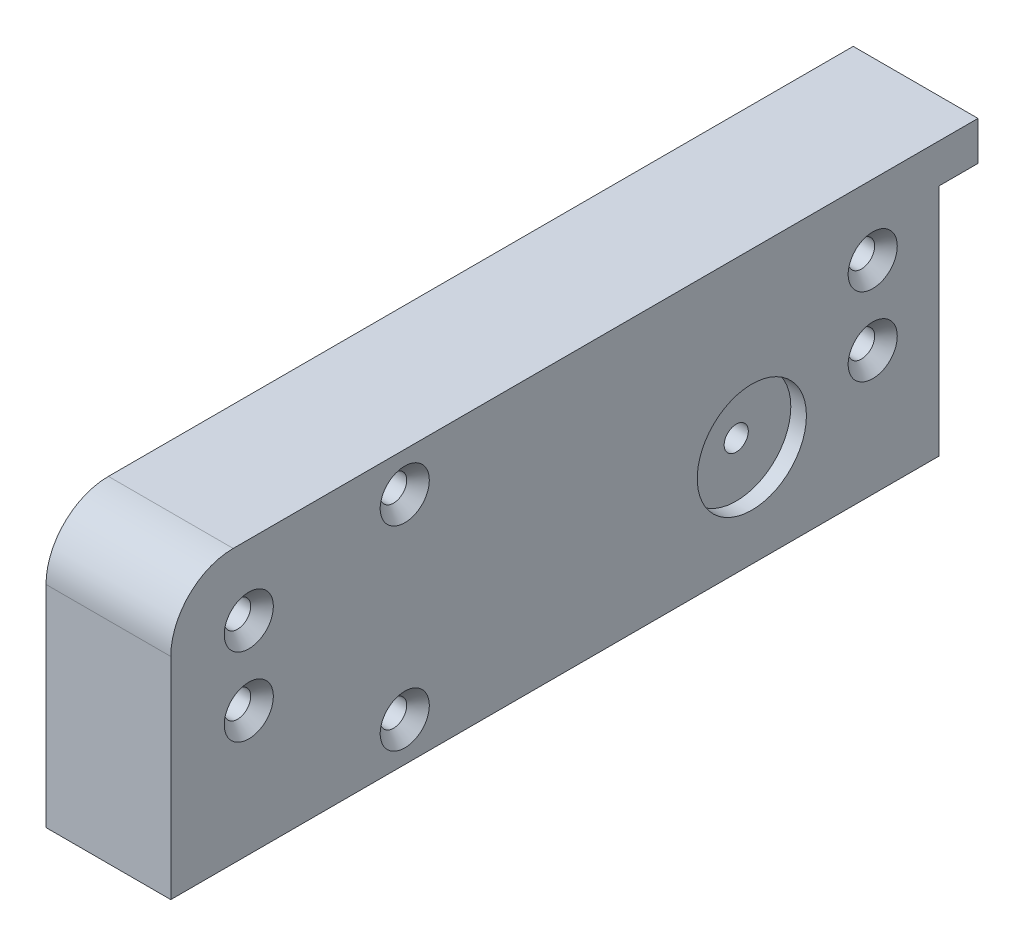
ISO-10303-21;
HEADER;
FILE_DESCRIPTION(('STEP AP214'),'2;1');
FILE_NAME('part.step','',(''),(''),'','','');
FILE_SCHEMA(('AUTOMOTIVE_DESIGN { 1 0 10303 214 1 1 1 1 }'));
ENDSEC;
DATA;
#1=APPLICATION_CONTEXT('core data for automotive mechanical design processes');
#2=APPLICATION_PROTOCOL_DEFINITION('international standard','automotive_design',2000,#1);
#3=PRODUCT_CONTEXT('',#1,'mechanical');
#4=PRODUCT('Part','Part','',(#3));
#5=PRODUCT_RELATED_PRODUCT_CATEGORY('part','',(#4));
#6=PRODUCT_DEFINITION_FORMATION('','',#4);
#7=PRODUCT_DEFINITION_CONTEXT('part definition',#1,'design');
#8=PRODUCT_DEFINITION('design','',#6,#7);
#9=PRODUCT_DEFINITION_SHAPE('','',#8);
#10=(LENGTH_UNIT() NAMED_UNIT(*) SI_UNIT(.MILLI.,.METRE.));
#11=(NAMED_UNIT(*) PLANE_ANGLE_UNIT() SI_UNIT($,.RADIAN.));
#12=(NAMED_UNIT(*) SI_UNIT($,.STERADIAN.) SOLID_ANGLE_UNIT());
#13=UNCERTAINTY_MEASURE_WITH_UNIT(LENGTH_MEASURE(1.E-05),#10,'distance_accuracy_value','');
#14=(GEOMETRIC_REPRESENTATION_CONTEXT(3) GLOBAL_UNCERTAINTY_ASSIGNED_CONTEXT((#13)) GLOBAL_UNIT_ASSIGNED_CONTEXT((#10,
#11,#12)) REPRESENTATION_CONTEXT('',''));
#15=CARTESIAN_POINT('',(0.,0.,0.));
#16=DIRECTION('',(0.,0.,1.));
#17=DIRECTION('',(1.,0.,0.));
#18=AXIS2_PLACEMENT_3D('',#15,#16,#17);
#19=CARTESIAN_POINT('',(0.,13.,24.));
#20=DIRECTION('',(1.,0.,0.));
#21=DIRECTION('',(0.,0.,-1.));
#22=AXIS2_PLACEMENT_3D('',#19,#20,#21);
#23=CYLINDRICAL_SURFACE('',#22,1.55);
#24=CARTESIAN_POINT('',(0.,13.,24.));
#25=DIRECTION('',(1.,0.,0.));
#26=DIRECTION('',(0.,0.,-1.));
#27=AXIS2_PLACEMENT_3D('',#24,#25,#26);
#28=CIRCLE('',#27,1.55);
#29=CARTESIAN_POINT('',(0.,13.,22.45));
#30=VERTEX_POINT('',#29);
#31=EDGE_CURVE('E340',#30,#30,#28,.T.);
#32=ORIENTED_EDGE('',*,*,#31,.F.);
#33=EDGE_LOOP('',(#32));
#34=FACE_BOUND('',#33,.T.);
#35=CARTESIAN_POINT('',(14.,13.,24.));
#36=DIRECTION('',(1.,0.,0.));
#37=DIRECTION('',(0.,0.,-1.));
#38=AXIS2_PLACEMENT_3D('',#35,#36,#37);
#39=CIRCLE('',#38,1.55);
#40=CARTESIAN_POINT('',(14.,13.,22.45));
#41=VERTEX_POINT('',#40);
#42=EDGE_CURVE('E337',#41,#41,#39,.F.);
#43=ORIENTED_EDGE('',*,*,#42,.F.);
#44=EDGE_LOOP('',(#43));
#45=FACE_BOUND('',#44,.T.);
#46=ADVANCED_FACE('F36',(#34,#45),#23,.F.);
#47=CARTESIAN_POINT('',(9.,28.7496306570153,90.0875000000005));
#48=DIRECTION('',(0.,1.,1.94507577148897E-13));
#49=DIRECTION('',(0.,-1.94507577148897E-13,1.));
#50=AXIS2_PLACEMENT_3D('',#47,#48,#49);
#51=PLANE('',#50);
#52=DIRECTION('',(0.,-1.94507577148897E-13,1.));
#53=VECTOR('',#52,1.);
#54=CARTESIAN_POINT('',(6.,28.7496306570153,90.0875000000005));
#55=LINE('',#54,#53);
#56=CARTESIAN_POINT('',(6.,28.7496306570159,86.9125000000005));
#57=VERTEX_POINT('',#56);
#58=CARTESIAN_POINT('',(6.,28.7496306570153,90.0875000000005));
#59=VERTEX_POINT('',#58);
#60=EDGE_CURVE('E207',#57,#59,#55,.T.);
#61=ORIENTED_EDGE('',*,*,#60,.F.);
#62=DIRECTION('',(-1.,0.,0.));
#63=VECTOR('',#62,1.);
#64=CARTESIAN_POINT('',(9.,28.7496306570159,86.9125000000005));
#65=LINE('',#64,#63);
#66=CARTESIAN_POINT('',(9.,28.7496306570159,86.9125000000005));
#67=VERTEX_POINT('',#66);
#68=EDGE_CURVE('E222',#67,#57,#65,.T.);
#69=ORIENTED_EDGE('',*,*,#68,.F.);
#70=DIRECTION('',(0.,1.94507577148897E-13,-1.));
#71=VECTOR('',#70,1.);
#72=CARTESIAN_POINT('',(9.,28.7496306570153,90.0875000000005));
#73=LINE('',#72,#71);
#74=CARTESIAN_POINT('',(9.,28.7496306570153,90.0875000000005));
#75=VERTEX_POINT('',#74);
#76=EDGE_CURVE('E203',#75,#67,#73,.T.);
#77=ORIENTED_EDGE('',*,*,#76,.F.);
#78=DIRECTION('',(-1.,0.,0.));
#79=VECTOR('',#78,1.);
#80=CARTESIAN_POINT('',(9.,28.7496306570153,90.0875000000005));
#81=LINE('',#80,#79);
#82=EDGE_CURVE('E223',#75,#59,#81,.T.);
#83=ORIENTED_EDGE('',*,*,#82,.T.);
#84=EDGE_LOOP('',(#61,#69,#77,#83));
#85=FACE_BOUND('',#84,.T.);
#86=ADVANCED_FACE('F374',(#85),#51,.F.);
#87=CARTESIAN_POINT('',(9.,25.9999999999994,91.675));
#88=DIRECTION('',(0.,0.499999999999836,0.866025403784533));
#89=DIRECTION('',(0.,-0.866025403784534,0.499999999999836));
#90=AXIS2_PLACEMENT_3D('',#87,#88,#89);
#91=PLANE('',#90);
#92=DIRECTION('',(0.,-0.866025403784534,0.499999999999836));
#93=VECTOR('',#92,1.);
#94=CARTESIAN_POINT('',(6.,25.9999999999994,91.675));
#95=LINE('',#94,#93);
#96=CARTESIAN_POINT('',(6.,25.9999999999994,91.675));
#97=VERTEX_POINT('',#96);
#98=EDGE_CURVE('E802',#59,#97,#95,.T.);
#99=ORIENTED_EDGE('',*,*,#98,.F.);
#100=ORIENTED_EDGE('',*,*,#82,.F.);
#101=DIRECTION('',(0.,0.866025403784533,-0.499999999999836));
#102=VECTOR('',#101,1.);
#103=CARTESIAN_POINT('',(9.,25.9999999999994,91.675));
#104=LINE('',#103,#102);
#105=CARTESIAN_POINT('',(9.,25.9999999999994,91.675));
#106=VERTEX_POINT('',#105);
#107=EDGE_CURVE('E219',#106,#75,#104,.T.);
#108=ORIENTED_EDGE('',*,*,#107,.F.);
#109=DIRECTION('',(-1.,0.,0.));
#110=VECTOR('',#109,1.);
#111=CARTESIAN_POINT('',(9.,25.9999999999994,91.675));
#112=LINE('',#111,#110);
#113=EDGE_CURVE('E227',#106,#97,#112,.T.);
#114=ORIENTED_EDGE('',*,*,#113,.T.);
#115=EDGE_LOOP('',(#99,#100,#108,#114));
#116=FACE_BOUND('',#115,.T.);
#117=ADVANCED_FACE('F380',(#116),#91,.F.);
#118=CARTESIAN_POINT('',(9.,23.2503693429841,90.0874999999995));
#119=DIRECTION('',(0.,-0.500000000000167,0.866025403784342));
#120=DIRECTION('',(0.,-0.866025403784342,-0.500000000000168));
#121=AXIS2_PLACEMENT_3D('',#118,#119,#120);
#122=PLANE('',#121);
#123=DIRECTION('',(0.,-0.866025403784342,-0.500000000000168));
#124=VECTOR('',#123,1.);
#125=CARTESIAN_POINT('',(6.,23.2503693429841,90.0874999999995));
#126=LINE('',#125,#124);
#127=CARTESIAN_POINT('',(6.,23.2503693429841,90.0874999999995));
#128=VERTEX_POINT('',#127);
#129=EDGE_CURVE('E800',#97,#128,#126,.T.);
#130=ORIENTED_EDGE('',*,*,#129,.F.);
#131=ORIENTED_EDGE('',*,*,#113,.F.);
#132=DIRECTION('',(0.,0.866025403784342,0.500000000000167));
#133=VECTOR('',#132,1.);
#134=CARTESIAN_POINT('',(9.,23.2503693429841,90.0874999999995));
#135=LINE('',#134,#133);
#136=CARTESIAN_POINT('',(9.,23.2503693429841,90.0874999999995));
#137=VERTEX_POINT('',#136);
#138=EDGE_CURVE('E216',#137,#106,#135,.T.);
#139=ORIENTED_EDGE('',*,*,#138,.F.);
#140=DIRECTION('',(-1.,0.,0.));
#141=VECTOR('',#140,1.);
#142=CARTESIAN_POINT('',(9.,23.2503693429841,90.0874999999995));
#143=LINE('',#142,#141);
#144=EDGE_CURVE('E230',#137,#128,#143,.T.);
#145=ORIENTED_EDGE('',*,*,#144,.T.);
#146=EDGE_LOOP('',(#130,#131,#139,#145));
#147=FACE_BOUND('',#146,.T.);
#148=ADVANCED_FACE('F435',(#147),#122,.F.);
#149=CARTESIAN_POINT('',(9.,23.2503693429847,86.9124999999995));
#150=DIRECTION('',(0.,-1.,-1.93414837951431E-13));
#151=DIRECTION('',(0.,1.93414837951431E-13,-1.));
#152=AXIS2_PLACEMENT_3D('',#149,#150,#151);
#153=PLANE('',#152);
#154=DIRECTION('',(0.,1.93414837951431E-13,-1.));
#155=VECTOR('',#154,1.);
#156=CARTESIAN_POINT('',(6.,23.2503693429847,86.9124999999995));
#157=LINE('',#156,#155);
#158=CARTESIAN_POINT('',(6.,23.2503693429847,86.9124999999995));
#159=VERTEX_POINT('',#158);
#160=EDGE_CURVE('E798',#128,#159,#157,.T.);
#161=ORIENTED_EDGE('',*,*,#160,.F.);
#162=ORIENTED_EDGE('',*,*,#144,.F.);
#163=DIRECTION('',(0.,-1.93414837951431E-13,1.));
#164=VECTOR('',#163,1.);
#165=CARTESIAN_POINT('',(9.,23.2503693429847,86.9124999999995));
#166=LINE('',#165,#164);
#167=CARTESIAN_POINT('',(9.,23.2503693429847,86.9124999999995));
#168=VERTEX_POINT('',#167);
#169=EDGE_CURVE('E213',#168,#137,#166,.T.);
#170=ORIENTED_EDGE('',*,*,#169,.F.);
#171=DIRECTION('',(-1.,0.,0.));
#172=VECTOR('',#171,1.);
#173=CARTESIAN_POINT('',(9.,23.2503693429847,86.9124999999995));
#174=LINE('',#173,#172);
#175=EDGE_CURVE('E233',#168,#159,#174,.T.);
#176=ORIENTED_EDGE('',*,*,#175,.T.);
#177=EDGE_LOOP('',(#161,#162,#170,#176));
#178=FACE_BOUND('',#177,.T.);
#179=ADVANCED_FACE('F439',(#178),#153,.F.);
#180=CARTESIAN_POINT('',(9.,26.0000000000006,85.325));
#181=DIRECTION('',(0.,-0.49999999999983,-0.866025403784537));
#182=DIRECTION('',(0.,0.866025403784537,-0.49999999999983));
#183=AXIS2_PLACEMENT_3D('',#180,#181,#182);
#184=PLANE('',#183);
#185=DIRECTION('',(0.,0.866025403784537,-0.49999999999983));
#186=VECTOR('',#185,1.);
#187=CARTESIAN_POINT('',(6.,26.0000000000006,85.325));
#188=LINE('',#187,#186);
#189=CARTESIAN_POINT('',(6.,26.0000000000006,85.325));
#190=VERTEX_POINT('',#189);
#191=EDGE_CURVE('E186',#159,#190,#188,.T.);
#192=ORIENTED_EDGE('',*,*,#191,.F.);
#193=ORIENTED_EDGE('',*,*,#175,.F.);
#194=DIRECTION('',(0.,-0.866025403784537,0.49999999999983));
#195=VECTOR('',#194,1.);
#196=CARTESIAN_POINT('',(9.,26.0000000000006,85.325));
#197=LINE('',#196,#195);
#198=CARTESIAN_POINT('',(9.,26.0000000000006,85.325));
#199=VERTEX_POINT('',#198);
#200=EDGE_CURVE('E210',#199,#168,#197,.T.);
#201=ORIENTED_EDGE('',*,*,#200,.F.);
#202=DIRECTION('',(-1.,0.,0.));
#203=VECTOR('',#202,1.);
#204=CARTESIAN_POINT('',(9.,26.0000000000006,85.325));
#205=LINE('',#204,#203);
#206=EDGE_CURVE('E236',#199,#190,#205,.T.);
#207=ORIENTED_EDGE('',*,*,#206,.T.);
#208=EDGE_LOOP('',(#192,#193,#201,#207));
#209=FACE_BOUND('',#208,.T.);
#210=ADVANCED_FACE('F443',(#209),#184,.F.);
#211=CARTESIAN_POINT('',(9.,28.7496306570159,86.9125000000005));
#212=DIRECTION('',(0.,0.500000000000163,-0.866025403784345));
#213=DIRECTION('',(0.,0.866025403784345,0.500000000000163));
#214=AXIS2_PLACEMENT_3D('',#211,#212,#213);
#215=PLANE('',#214);
#216=DIRECTION('',(0.,0.866025403784345,0.500000000000163));
#217=VECTOR('',#216,1.);
#218=CARTESIAN_POINT('',(6.,28.7496306570159,86.9125000000005));
#219=LINE('',#218,#217);
#220=EDGE_CURVE('E176',#190,#57,#219,.T.);
#221=ORIENTED_EDGE('',*,*,#220,.F.);
#222=ORIENTED_EDGE('',*,*,#206,.F.);
#223=DIRECTION('',(0.,-0.866025403784345,-0.500000000000163));
#224=VECTOR('',#223,1.);
#225=CARTESIAN_POINT('',(9.,28.7496306570159,86.9125000000005));
#226=LINE('',#225,#224);
#227=EDGE_CURVE('E206',#67,#199,#226,.T.);
#228=ORIENTED_EDGE('',*,*,#227,.F.);
#229=ORIENTED_EDGE('',*,*,#68,.T.);
#230=EDGE_LOOP('',(#221,#222,#228,#229));
#231=FACE_BOUND('',#230,.T.);
#232=ADVANCED_FACE('F428',(#231),#215,.F.);
#233=CARTESIAN_POINT('',(9.,26.,11.675));
#234=DIRECTION('',(0.,0.499999999999971,0.866025403784456));
#235=DIRECTION('',(0.,-0.866025403784456,0.499999999999971));
#236=AXIS2_PLACEMENT_3D('',#233,#234,#235);
#237=PLANE('',#236);
#238=DIRECTION('',(0.,-0.866025403784456,0.499999999999971));
#239=VECTOR('',#238,1.);
#240=CARTESIAN_POINT('',(6.,26.,11.675));
#241=LINE('',#240,#239);
#242=CARTESIAN_POINT('',(6.,28.7496306570155,10.0875000000002));
#243=VERTEX_POINT('',#242);
#244=CARTESIAN_POINT('',(6.,26.,11.675));
#245=VERTEX_POINT('',#244);
#246=EDGE_CURVE('E169',#243,#245,#241,.T.);
#247=ORIENTED_EDGE('',*,*,#246,.F.);
#248=DIRECTION('',(-1.,0.,0.));
#249=VECTOR('',#248,1.);
#250=CARTESIAN_POINT('',(9.,28.7496306570155,10.0875000000002));
#251=LINE('',#250,#249);
#252=CARTESIAN_POINT('',(9.,28.7496306570155,10.0875000000002));
#253=VERTEX_POINT('',#252);
#254=EDGE_CURVE('E183',#253,#243,#251,.T.);
#255=ORIENTED_EDGE('',*,*,#254,.F.);
#256=DIRECTION('',(0.,0.866025403784456,-0.499999999999971));
#257=VECTOR('',#256,1.);
#258=CARTESIAN_POINT('',(9.,26.,11.675));
#259=LINE('',#258,#257);
#260=CARTESIAN_POINT('',(9.,26.,11.675));
#261=VERTEX_POINT('',#260);
#262=EDGE_CURVE('E226',#261,#253,#259,.T.);
#263=ORIENTED_EDGE('',*,*,#262,.F.);
#264=DIRECTION('',(-1.,0.,0.));
#265=VECTOR('',#264,1.);
#266=CARTESIAN_POINT('',(9.,26.,11.675));
#267=LINE('',#266,#265);
#268=EDGE_CURVE('E185',#261,#245,#267,.T.);
#269=ORIENTED_EDGE('',*,*,#268,.T.);
#270=EDGE_LOOP('',(#247,#255,#263,#269));
#271=FACE_BOUND('',#270,.T.);
#272=ADVANCED_FACE('F181',(#271),#237,.F.);
#273=CARTESIAN_POINT('',(9.,23.2503693429844,10.0875));
#274=DIRECTION('',(0.,-0.500000000000007,0.866025403784435));
#275=DIRECTION('',(0.,-0.866025403784435,-0.500000000000007));
#276=AXIS2_PLACEMENT_3D('',#273,#274,#275);
#277=PLANE('',#276);
#278=DIRECTION('',(0.,-0.866025403784435,-0.500000000000007));
#279=VECTOR('',#278,1.);
#280=CARTESIAN_POINT('',(6.,23.2503693429844,10.0875));
#281=LINE('',#280,#279);
#282=CARTESIAN_POINT('',(6.,23.2503693429844,10.0875));
#283=VERTEX_POINT('',#282);
#284=EDGE_CURVE('E187',#245,#283,#281,.T.);
#285=ORIENTED_EDGE('',*,*,#284,.F.);
#286=ORIENTED_EDGE('',*,*,#268,.F.);
#287=DIRECTION('',(0.,0.866025403784435,0.500000000000007));
#288=VECTOR('',#287,1.);
#289=CARTESIAN_POINT('',(9.,23.2503693429844,10.0875));
#290=LINE('',#289,#288);
#291=CARTESIAN_POINT('',(9.,23.2503693429844,10.0875));
#292=VERTEX_POINT('',#291);
#293=EDGE_CURVE('E194',#292,#261,#290,.T.);
#294=ORIENTED_EDGE('',*,*,#293,.F.);
#295=DIRECTION('',(-1.,0.,0.));
#296=VECTOR('',#295,1.);
#297=CARTESIAN_POINT('',(9.,23.2503693429844,10.0875));
#298=LINE('',#297,#296);
#299=EDGE_CURVE('E816',#292,#283,#298,.T.);
#300=ORIENTED_EDGE('',*,*,#299,.T.);
#301=EDGE_LOOP('',(#285,#286,#294,#300));
#302=FACE_BOUND('',#301,.T.);
#303=ADVANCED_FACE('F407',(#302),#277,.F.);
#304=CARTESIAN_POINT('',(9.,23.2503693429844,6.91249999999998));
#305=DIRECTION('',(0.,-1.,0.));
#306=DIRECTION('',(0.,0.,-1.));
#307=AXIS2_PLACEMENT_3D('',#304,#305,#306);
#308=PLANE('',#307);
#309=DIRECTION('',(0.,0.,-1.));
#310=VECTOR('',#309,1.);
#311=CARTESIAN_POINT('',(6.,23.2503693429844,6.91249999999998));
#312=LINE('',#311,#310);
#313=CARTESIAN_POINT('',(6.,23.2503693429844,6.91249999999998));
#314=VERTEX_POINT('',#313);
#315=EDGE_CURVE('E794',#283,#314,#312,.T.);
#316=ORIENTED_EDGE('',*,*,#315,.F.);
#317=ORIENTED_EDGE('',*,*,#299,.F.);
#318=DIRECTION('',(0.,0.,1.));
#319=VECTOR('',#318,1.);
#320=CARTESIAN_POINT('',(9.,23.2503693429844,6.91249999999998));
#321=LINE('',#320,#319);
#322=CARTESIAN_POINT('',(9.,23.2503693429844,6.91249999999998));
#323=VERTEX_POINT('',#322);
#324=EDGE_CURVE('E199',#323,#292,#321,.T.);
#325=ORIENTED_EDGE('',*,*,#324,.F.);
#326=DIRECTION('',(-1.,0.,0.));
#327=VECTOR('',#326,1.);
#328=CARTESIAN_POINT('',(9.,23.2503693429844,6.91249999999998));
#329=LINE('',#328,#327);
#330=EDGE_CURVE('E819',#323,#314,#329,.T.);
#331=ORIENTED_EDGE('',*,*,#330,.T.);
#332=EDGE_LOOP('',(#316,#317,#325,#331));
#333=FACE_BOUND('',#332,.T.);
#334=ADVANCED_FACE('F410',(#333),#308,.F.);
#335=CARTESIAN_POINT('',(9.,26.,5.325));
#336=DIRECTION('',(0.,-0.499999999999994,-0.866025403784442));
#337=DIRECTION('',(0.,0.866025403784442,-0.499999999999994));
#338=AXIS2_PLACEMENT_3D('',#335,#336,#337);
#339=PLANE('',#338);
#340=DIRECTION('',(0.,0.866025403784442,-0.499999999999994));
#341=VECTOR('',#340,1.);
#342=CARTESIAN_POINT('',(6.,26.,5.325));
#343=LINE('',#342,#341);
#344=CARTESIAN_POINT('',(6.,26.,5.325));
#345=VERTEX_POINT('',#344);
#346=EDGE_CURVE('E792',#314,#345,#343,.T.);
#347=ORIENTED_EDGE('',*,*,#346,.F.);
#348=ORIENTED_EDGE('',*,*,#330,.F.);
#349=DIRECTION('',(0.,-0.866025403784442,0.499999999999994));
#350=VECTOR('',#349,1.);
#351=CARTESIAN_POINT('',(9.,26.,5.325));
#352=LINE('',#351,#350);
#353=CARTESIAN_POINT('',(9.,26.,5.325));
#354=VERTEX_POINT('',#353);
#355=EDGE_CURVE('E810',#354,#323,#352,.T.);
#356=ORIENTED_EDGE('',*,*,#355,.F.);
#357=DIRECTION('',(-1.,0.,0.));
#358=VECTOR('',#357,1.);
#359=CARTESIAN_POINT('',(9.,26.,5.325));
#360=LINE('',#359,#358);
#361=EDGE_CURVE('E196',#354,#345,#360,.T.);
#362=ORIENTED_EDGE('',*,*,#361,.T.);
#363=EDGE_LOOP('',(#347,#348,#356,#362));
#364=FACE_BOUND('',#363,.T.);
#365=ADVANCED_FACE('F414',(#364),#339,.F.);
#366=CARTESIAN_POINT('',(9.,28.7496306570156,6.91250000000002));
#367=DIRECTION('',(0.,0.500000000000006,-0.866025403784435));
#368=DIRECTION('',(0.,0.866025403784435,0.500000000000006));
#369=AXIS2_PLACEMENT_3D('',#366,#367,#368);
#370=PLANE('',#369);
#371=DIRECTION('',(0.,0.866025403784435,0.500000000000006));
#372=VECTOR('',#371,1.);
#373=CARTESIAN_POINT('',(6.,28.7496306570156,6.91250000000002));
#374=LINE('',#373,#372);
#375=CARTESIAN_POINT('',(6.,28.7496306570156,6.91250000000002));
#376=VERTEX_POINT('',#375);
#377=EDGE_CURVE('E172',#345,#376,#374,.T.);
#378=ORIENTED_EDGE('',*,*,#377,.F.);
#379=ORIENTED_EDGE('',*,*,#361,.F.);
#380=DIRECTION('',(0.,-0.866025403784435,-0.500000000000006));
#381=VECTOR('',#380,1.);
#382=CARTESIAN_POINT('',(9.,28.7496306570156,6.91250000000002));
#383=LINE('',#382,#381);
#384=CARTESIAN_POINT('',(9.,28.7496306570156,6.91250000000002));
#385=VERTEX_POINT('',#384);
#386=EDGE_CURVE('E807',#385,#354,#383,.T.);
#387=ORIENTED_EDGE('',*,*,#386,.F.);
#388=DIRECTION('',(-1.,0.,0.));
#389=VECTOR('',#388,1.);
#390=CARTESIAN_POINT('',(9.,28.7496306570156,6.91250000000002));
#391=LINE('',#390,#389);
#392=EDGE_CURVE('E193',#385,#376,#391,.T.);
#393=ORIENTED_EDGE('',*,*,#392,.T.);
#394=EDGE_LOOP('',(#378,#379,#387,#393));
#395=FACE_BOUND('',#394,.T.);
#396=ADVANCED_FACE('F418',(#395),#370,.F.);
#397=CARTESIAN_POINT('',(9.,28.7496306570155,10.0875000000002));
#398=DIRECTION('',(0.,1.,0.));
#399=DIRECTION('',(0.,0.,1.));
#400=AXIS2_PLACEMENT_3D('',#397,#398,#399);
#401=PLANE('',#400);
#402=DIRECTION('',(0.,0.,1.));
#403=VECTOR('',#402,1.);
#404=CARTESIAN_POINT('',(6.,28.7496306570155,10.0875000000002));
#405=LINE('',#404,#403);
#406=EDGE_CURVE('E166',#376,#243,#405,.T.);
#407=ORIENTED_EDGE('',*,*,#406,.F.);
#408=ORIENTED_EDGE('',*,*,#392,.F.);
#409=DIRECTION('',(0.,0.,-1.));
#410=VECTOR('',#409,1.);
#411=CARTESIAN_POINT('',(9.,28.7496306570155,10.0875000000002));
#412=LINE('',#411,#410);
#413=EDGE_CURVE('E191',#253,#385,#412,.T.);
#414=ORIENTED_EDGE('',*,*,#413,.F.);
#415=ORIENTED_EDGE('',*,*,#254,.T.);
#416=EDGE_LOOP('',(#407,#408,#414,#415));
#417=FACE_BOUND('',#416,.T.);
#418=ADVANCED_FACE('F189',(#417),#401,.F.);
#419=CARTESIAN_POINT('',(16.,26.,8.5));
#420=DIRECTION('',(1.,0.,0.));
#421=DIRECTION('',(0.,0.,-1.));
#422=AXIS2_PLACEMENT_3D('',#419,#420,#421);
#423=CYLINDRICAL_SURFACE('',#422,1.69999999999999);
#424=CARTESIAN_POINT('',(14.55,26.,8.5));
#425=DIRECTION('',(1.,0.,0.));
#426=DIRECTION('',(0.,0.,-1.));
#427=AXIS2_PLACEMENT_3D('',#424,#425,#426);
#428=CIRCLE('',#427,1.69999999999999);
#429=CARTESIAN_POINT('',(14.55,26.,6.80000000000001));
#430=VERTEX_POINT('',#429);
#431=EDGE_CURVE('E278',#430,#430,#428,.T.);
#432=ORIENTED_EDGE('',*,*,#431,.T.);
#433=EDGE_LOOP('',(#432));
#434=FACE_BOUND('',#433,.T.);
#435=CARTESIAN_POINT('',(9.,26.,8.5));
#436=DIRECTION('',(-1.,0.,0.));
#437=DIRECTION('',(0.,0.,1.));
#438=AXIS2_PLACEMENT_3D('',#435,#436,#437);
#439=CIRCLE('',#438,1.69999999999999);
#440=CARTESIAN_POINT('',(9.,26.,10.2));
#441=VERTEX_POINT('',#440);
#442=EDGE_CURVE('E245',#441,#441,#439,.F.);
#443=ORIENTED_EDGE('',*,*,#442,.F.);
#444=EDGE_LOOP('',(#443));
#445=FACE_BOUND('',#444,.T.);
#446=ADVANCED_FACE('F425',(#434,#445),#423,.F.);
#447=CARTESIAN_POINT('',(16.,26.,88.5));
#448=DIRECTION('',(1.,0.,0.));
#449=DIRECTION('',(0.,0.,-1.));
#450=AXIS2_PLACEMENT_3D('',#447,#448,#449);
#451=CYLINDRICAL_SURFACE('',#450,1.69999999999999);
#452=CARTESIAN_POINT('',(14.55,26.,88.5));
#453=DIRECTION('',(1.,0.,0.));
#454=DIRECTION('',(0.,0.,-1.));
#455=AXIS2_PLACEMENT_3D('',#452,#453,#454);
#456=CIRCLE('',#455,1.69999999999999);
#457=CARTESIAN_POINT('',(14.55,26.,86.8));
#458=VERTEX_POINT('',#457);
#459=EDGE_CURVE('E244',#458,#458,#456,.T.);
#460=ORIENTED_EDGE('',*,*,#459,.T.);
#461=EDGE_LOOP('',(#460));
#462=FACE_BOUND('',#461,.T.);
#463=CARTESIAN_POINT('',(9.,26.,88.5));
#464=DIRECTION('',(-1.,0.,0.));
#465=DIRECTION('',(0.,0.,1.));
#466=AXIS2_PLACEMENT_3D('',#463,#464,#465);
#467=CIRCLE('',#466,1.69999999999999);
#468=CARTESIAN_POINT('',(9.,26.,90.2));
#469=VERTEX_POINT('',#468);
#470=EDGE_CURVE('E330',#469,#469,#467,.F.);
#471=ORIENTED_EDGE('',*,*,#470,.F.);
#472=EDGE_LOOP('',(#471));
#473=FACE_BOUND('',#472,.T.);
#474=ADVANCED_FACE('F455',(#462,#473),#451,.F.);
#475=CARTESIAN_POINT('',(16.,30.,0.));
#476=DIRECTION('',(0.,0.,1.));
#477=DIRECTION('',(0.,-1.,0.));
#478=AXIS2_PLACEMENT_3D('',#475,#476,#477);
#479=PLANE('',#478);
#480=DIRECTION('',(0.,1.,0.));
#481=VECTOR('',#480,1.);
#482=CARTESIAN_POINT('',(0.,30.,0.));
#483=LINE('',#482,#481);
#484=CARTESIAN_POINT('',(0.,0.,0.));
#485=VERTEX_POINT('',#484);
#486=CARTESIAN_POINT('',(0.,30.,0.));
#487=VERTEX_POINT('',#486);
#488=EDGE_CURVE('E290',#485,#487,#483,.T.);
#489=ORIENTED_EDGE('',*,*,#488,.T.);
#490=DIRECTION('',(-1.,0.,0.));
#491=VECTOR('',#490,1.);
#492=CARTESIAN_POINT('',(16.,30.,0.));
#493=LINE('',#492,#491);
#494=CARTESIAN_POINT('',(16.,30.,0.));
#495=VERTEX_POINT('',#494);
#496=EDGE_CURVE('E177',#495,#487,#493,.T.);
#497=ORIENTED_EDGE('',*,*,#496,.F.);
#498=DIRECTION('',(0.,1.,0.));
#499=VECTOR('',#498,1.);
#500=CARTESIAN_POINT('',(16.,30.,0.));
#501=LINE('',#500,#499);
#502=CARTESIAN_POINT('',(16.,0.,0.));
#503=VERTEX_POINT('',#502);
#504=EDGE_CURVE('E291',#503,#495,#501,.T.);
#505=ORIENTED_EDGE('',*,*,#504,.F.);
#506=DIRECTION('',(-1.,0.,0.));
#507=VECTOR('',#506,1.);
#508=CARTESIAN_POINT('',(16.,0.,0.));
#509=LINE('',#508,#507);
#510=EDGE_CURVE('E305',#503,#485,#509,.T.);
#511=ORIENTED_EDGE('',*,*,#510,.T.);
#512=EDGE_LOOP('',(#489,#497,#505,#511));
#513=FACE_BOUND('',#512,.T.);
#514=ADVANCED_FACE('F360',(#513),#479,.F.);
#515=CARTESIAN_POINT('',(16.,30.,-4.99999999999999));
#516=DIRECTION('',(0.,1.,0.));
#517=DIRECTION('',(0.,0.,1.));
#518=AXIS2_PLACEMENT_3D('',#515,#516,#517);
#519=PLANE('',#518);
#520=DIRECTION('',(0.,0.,-1.));
#521=VECTOR('',#520,1.);
#522=CARTESIAN_POINT('',(0.,30.,-4.99999999999999));
#523=LINE('',#522,#521);
#524=CARTESIAN_POINT('',(0.,30.,-4.99999999999999));
#525=VERTEX_POINT('',#524);
#526=EDGE_CURVE('E308',#487,#525,#523,.T.);
#527=ORIENTED_EDGE('',*,*,#526,.T.);
#528=DIRECTION('',(-1.,0.,0.));
#529=VECTOR('',#528,1.);
#530=CARTESIAN_POINT('',(16.,30.,-4.99999999999999));
#531=LINE('',#530,#529);
#532=CARTESIAN_POINT('',(16.,30.,-4.99999999999999));
#533=VERTEX_POINT('',#532);
#534=EDGE_CURVE('E325',#533,#525,#531,.T.);
#535=ORIENTED_EDGE('',*,*,#534,.F.);
#536=DIRECTION('',(0.,0.,-1.));
#537=VECTOR('',#536,1.);
#538=CARTESIAN_POINT('',(16.,30.,-4.99999999999999));
#539=LINE('',#538,#537);
#540=EDGE_CURVE('E294',#495,#533,#539,.T.);
#541=ORIENTED_EDGE('',*,*,#540,.F.);
#542=ORIENTED_EDGE('',*,*,#496,.T.);
#543=EDGE_LOOP('',(#527,#535,#541,#542));
#544=FACE_BOUND('',#543,.T.);
#545=ADVANCED_FACE('F513',(#544),#519,.F.);
#546=CARTESIAN_POINT('',(16.,35.,-4.99999999999999));
#547=DIRECTION('',(0.,0.,1.));
#548=DIRECTION('',(1.,0.,0.));
#549=AXIS2_PLACEMENT_3D('',#546,#547,#548);
#550=PLANE('',#549);
#551=DIRECTION('',(0.,1.,0.));
#552=VECTOR('',#551,1.);
#553=CARTESIAN_POINT('',(0.,35.,-4.99999999999999));
#554=LINE('',#553,#552);
#555=CARTESIAN_POINT('',(0.,35.,-4.99999999999999));
#556=VERTEX_POINT('',#555);
#557=EDGE_CURVE('E310',#525,#556,#554,.T.);
#558=ORIENTED_EDGE('',*,*,#557,.T.);
#559=DIRECTION('',(-1.,0.,0.));
#560=VECTOR('',#559,1.);
#561=CARTESIAN_POINT('',(16.,35.,-4.99999999999999));
#562=LINE('',#561,#560);
#563=CARTESIAN_POINT('',(16.,35.,-4.99999999999999));
#564=VERTEX_POINT('',#563);
#565=EDGE_CURVE('E322',#564,#556,#562,.T.);
#566=ORIENTED_EDGE('',*,*,#565,.F.);
#567=DIRECTION('',(0.,1.,0.));
#568=VECTOR('',#567,1.);
#569=CARTESIAN_POINT('',(16.,35.,-4.99999999999999));
#570=LINE('',#569,#568);
#571=EDGE_CURVE('E297',#533,#564,#570,.T.);
#572=ORIENTED_EDGE('',*,*,#571,.F.);
#573=ORIENTED_EDGE('',*,*,#534,.T.);
#574=EDGE_LOOP('',(#558,#566,#572,#573));
#575=FACE_BOUND('',#574,.T.);
#576=ADVANCED_FACE('F510',(#575),#550,.F.);
#577=CARTESIAN_POINT('',(16.,35.,98.5));
#578=DIRECTION('',(0.,-1.,0.));
#579=DIRECTION('',(0.,0.,-1.));
#580=AXIS2_PLACEMENT_3D('',#577,#578,#579);
#581=PLANE('',#580);
#582=DIRECTION('',(0.,0.,1.));
#583=VECTOR('',#582,1.);
#584=CARTESIAN_POINT('',(0.,35.,98.5));
#585=LINE('',#584,#583);
#586=CARTESIAN_POINT('',(0.,35.,90.5));
#587=VERTEX_POINT('',#586);
#588=EDGE_CURVE('E312',#556,#587,#585,.T.);
#589=ORIENTED_EDGE('',*,*,#588,.T.);
#590=DIRECTION('',(-1.,0.,0.));
#591=VECTOR('',#590,1.);
#592=CARTESIAN_POINT('',(16.,35.,90.5));
#593=LINE('',#592,#591);
#594=CARTESIAN_POINT('',(16.,35.,90.5));
#595=VERTEX_POINT('',#594);
#596=EDGE_CURVE('E44',#587,#595,#593,.F.);
#597=ORIENTED_EDGE('',*,*,#596,.T.);
#598=DIRECTION('',(0.,0.,1.));
#599=VECTOR('',#598,1.);
#600=CARTESIAN_POINT('',(16.,35.,98.5));
#601=LINE('',#600,#599);
#602=EDGE_CURVE('E299',#564,#595,#601,.T.);
#603=ORIENTED_EDGE('',*,*,#602,.F.);
#604=ORIENTED_EDGE('',*,*,#565,.T.);
#605=EDGE_LOOP('',(#589,#597,#603,#604));
#606=FACE_BOUND('',#605,.T.);
#607=ADVANCED_FACE('F507',(#606),#581,.F.);
#608=CARTESIAN_POINT('',(16.,0.,98.5));
#609=DIRECTION('',(0.,0.,-1.));
#610=DIRECTION('',(-1.,0.,0.));
#611=AXIS2_PLACEMENT_3D('',#608,#609,#610);
#612=PLANE('',#611);
#613=DIRECTION('',(0.,-1.,0.));
#614=VECTOR('',#613,1.);
#615=CARTESIAN_POINT('',(16.,0.,98.5));
#616=LINE('',#615,#614);
#617=CARTESIAN_POINT('',(16.,27.,98.5));
#618=VERTEX_POINT('',#617);
#619=CARTESIAN_POINT('',(16.,0.,98.5));
#620=VERTEX_POINT('',#619);
#621=EDGE_CURVE('E301',#618,#620,#616,.T.);
#622=ORIENTED_EDGE('',*,*,#621,.F.);
#623=DIRECTION('',(-1.,0.,0.));
#624=VECTOR('',#623,1.);
#625=CARTESIAN_POINT('',(16.,27.,98.5));
#626=LINE('',#625,#624);
#627=CARTESIAN_POINT('',(0.,27.,98.5));
#628=VERTEX_POINT('',#627);
#629=EDGE_CURVE('E336',#618,#628,#626,.T.);
#630=ORIENTED_EDGE('',*,*,#629,.T.);
#631=DIRECTION('',(0.,-1.,0.));
#632=VECTOR('',#631,1.);
#633=CARTESIAN_POINT('',(0.,0.,98.5));
#634=LINE('',#633,#632);
#635=CARTESIAN_POINT('',(0.,0.,98.5));
#636=VERTEX_POINT('',#635);
#637=EDGE_CURVE('E314',#628,#636,#634,.T.);
#638=ORIENTED_EDGE('',*,*,#637,.T.);
#639=DIRECTION('',(-1.,0.,0.));
#640=VECTOR('',#639,1.);
#641=CARTESIAN_POINT('',(16.,0.,98.5));
#642=LINE('',#641,#640);
#643=EDGE_CURVE('E319',#620,#636,#642,.T.);
#644=ORIENTED_EDGE('',*,*,#643,.F.);
#645=EDGE_LOOP('',(#622,#630,#638,#644));
#646=FACE_BOUND('',#645,.T.);
#647=ADVANCED_FACE('F347',(#646),#612,.F.);
#648=CARTESIAN_POINT('',(16.,0.,0.));
#649=DIRECTION('',(0.,1.,0.));
#650=DIRECTION('',(0.,0.,1.));
#651=AXIS2_PLACEMENT_3D('',#648,#649,#650);
#652=PLANE('',#651);
#653=DIRECTION('',(0.,0.,-1.));
#654=VECTOR('',#653,1.);
#655=CARTESIAN_POINT('',(0.,0.,0.));
#656=LINE('',#655,#654);
#657=EDGE_CURVE('E295',#636,#485,#656,.T.);
#658=ORIENTED_EDGE('',*,*,#657,.T.);
#659=ORIENTED_EDGE('',*,*,#510,.F.);
#660=DIRECTION('',(0.,0.,-1.));
#661=VECTOR('',#660,1.);
#662=CARTESIAN_POINT('',(16.,0.,0.));
#663=LINE('',#662,#661);
#664=EDGE_CURVE('E303',#620,#503,#663,.T.);
#665=ORIENTED_EDGE('',*,*,#664,.F.);
#666=ORIENTED_EDGE('',*,*,#643,.T.);
#667=EDGE_LOOP('',(#658,#659,#665,#666));
#668=FACE_BOUND('',#667,.T.);
#669=ADVANCED_FACE('F356',(#668),#652,.F.);
#670=CARTESIAN_POINT('',(16.,0.,0.));
#671=DIRECTION('',(-1.,0.,0.));
#672=DIRECTION('',(0.,0.,1.));
#673=AXIS2_PLACEMENT_3D('',#670,#671,#672);
#674=PLANE('',#673);
#675=CARTESIAN_POINT('',(16.,13.,24.));
#676=DIRECTION('',(1.,0.,0.));
#677=DIRECTION('',(0.,0.,-1.));
#678=AXIS2_PLACEMENT_3D('',#675,#676,#677);
#679=CIRCLE('',#678,7.);
#680=CARTESIAN_POINT('',(16.,13.,17.));
#681=VERTEX_POINT('',#680);
#682=EDGE_CURVE('E772',#681,#681,#679,.T.);
#683=ORIENTED_EDGE('',*,*,#682,.F.);
#684=EDGE_LOOP('',(#683));
#685=FACE_BOUND('',#684,.T.);
#686=CARTESIAN_POINT('',(16.,26.,88.5));
#687=DIRECTION('',(1.,0.,0.));
#688=DIRECTION('',(0.,0.,-1.));
#689=AXIS2_PLACEMENT_3D('',#686,#687,#688);
#690=CIRCLE('',#689,3.15);
#691=CARTESIAN_POINT('',(16.,26.,85.35));
#692=VERTEX_POINT('',#691);
#693=EDGE_CURVE('E241',#692,#692,#690,.T.);
#694=ORIENTED_EDGE('',*,*,#693,.F.);
#695=EDGE_LOOP('',(#694));
#696=FACE_BOUND('',#695,.T.);
#697=CARTESIAN_POINT('',(16.,16.,88.5));
#698=DIRECTION('',(1.,0.,0.));
#699=DIRECTION('',(0.,0.,-1.));
#700=AXIS2_PLACEMENT_3D('',#697,#698,#699);
#701=CIRCLE('',#700,3.15);
#702=CARTESIAN_POINT('',(16.,16.,85.35));
#703=VERTEX_POINT('',#702);
#704=EDGE_CURVE('E248',#703,#703,#701,.T.);
#705=ORIENTED_EDGE('',*,*,#704,.F.);
#706=EDGE_LOOP('',(#705));
#707=FACE_BOUND('',#706,.T.);
#708=CARTESIAN_POINT('',(16.,30.,68.5));
#709=DIRECTION('',(1.,0.,0.));
#710=DIRECTION('',(0.,0.,-1.));
#711=AXIS2_PLACEMENT_3D('',#708,#709,#710);
#712=CIRCLE('',#711,3.15);
#713=CARTESIAN_POINT('',(16.,30.,65.35));
#714=VERTEX_POINT('',#713);
#715=EDGE_CURVE('E257',#714,#714,#712,.T.);
#716=ORIENTED_EDGE('',*,*,#715,.F.);
#717=EDGE_LOOP('',(#716));
#718=FACE_BOUND('',#717,.T.);
#719=CARTESIAN_POINT('',(16.,4.99999999999998,68.5));
#720=DIRECTION('',(1.,0.,0.));
#721=DIRECTION('',(0.,0.,-1.));
#722=AXIS2_PLACEMENT_3D('',#719,#720,#721);
#723=CIRCLE('',#722,3.15);
#724=CARTESIAN_POINT('',(16.,4.99999999999998,65.35));
#725=VERTEX_POINT('',#724);
#726=EDGE_CURVE('E266',#725,#725,#723,.T.);
#727=ORIENTED_EDGE('',*,*,#726,.F.);
#728=EDGE_LOOP('',(#727));
#729=FACE_BOUND('',#728,.T.);
#730=CARTESIAN_POINT('',(16.,26.,8.5));
#731=DIRECTION('',(1.,0.,0.));
#732=DIRECTION('',(0.,0.,-1.));
#733=AXIS2_PLACEMENT_3D('',#730,#731,#732);
#734=CIRCLE('',#733,3.15);
#735=CARTESIAN_POINT('',(16.,26.,5.35));
#736=VERTEX_POINT('',#735);
#737=EDGE_CURVE('E275',#736,#736,#734,.T.);
#738=ORIENTED_EDGE('',*,*,#737,.F.);
#739=EDGE_LOOP('',(#738));
#740=FACE_BOUND('',#739,.T.);
#741=CARTESIAN_POINT('',(16.,16.,8.5));
#742=DIRECTION('',(1.,0.,0.));
#743=DIRECTION('',(0.,0.,-1.));
#744=AXIS2_PLACEMENT_3D('',#741,#742,#743);
#745=CIRCLE('',#744,3.15);
#746=CARTESIAN_POINT('',(16.,16.,5.35));
#747=VERTEX_POINT('',#746);
#748=EDGE_CURVE('E281',#747,#747,#745,.T.);
#749=ORIENTED_EDGE('',*,*,#748,.F.);
#750=EDGE_LOOP('',(#749));
#751=FACE_BOUND('',#750,.T.);
#752=ORIENTED_EDGE('',*,*,#602,.T.);
#753=CARTESIAN_POINT('',(16.,27.,90.5));
#754=DIRECTION('',(-1.,0.,0.));
#755=DIRECTION('',(0.,0.,1.));
#756=AXIS2_PLACEMENT_3D('',#753,#754,#755);
#757=CIRCLE('',#756,8.);
#758=EDGE_CURVE('E11',#595,#618,#757,.F.);
#759=ORIENTED_EDGE('',*,*,#758,.T.);
#760=ORIENTED_EDGE('',*,*,#621,.T.);
#761=ORIENTED_EDGE('',*,*,#664,.T.);
#762=ORIENTED_EDGE('',*,*,#504,.T.);
#763=ORIENTED_EDGE('',*,*,#540,.T.);
#764=ORIENTED_EDGE('',*,*,#571,.T.);
#765=EDGE_LOOP('',(#752,#759,#760,#761,#762,#763,#764));
#766=FACE_BOUND('',#765,.T.);
#767=ADVANCED_FACE('F363',(#685,#696,#707,#718,#729,#740,#751,#766),#674,.F.);
#768=CARTESIAN_POINT('',(0.,0.,0.));
#769=DIRECTION('',(-1.,0.,0.));
#770=DIRECTION('',(0.,0.,1.));
#771=AXIS2_PLACEMENT_3D('',#768,#769,#770);
#772=PLANE('',#771);
#773=ORIENTED_EDGE('',*,*,#31,.T.);
#774=EDGE_LOOP('',(#773));
#775=FACE_BOUND('',#774,.T.);
#776=CARTESIAN_POINT('',(0.,26.,8.5));
#777=DIRECTION('',(-1.,0.,0.));
#778=DIRECTION('',(0.,0.,1.));
#779=AXIS2_PLACEMENT_3D('',#776,#777,#778);
#780=CIRCLE('',#779,4.1);
#781=CARTESIAN_POINT('',(0.,26.,12.6));
#782=VERTEX_POINT('',#781);
#783=EDGE_CURVE('E783',#782,#782,#780,.T.);
#784=ORIENTED_EDGE('',*,*,#783,.F.);
#785=EDGE_LOOP('',(#784));
#786=FACE_BOUND('',#785,.T.);
#787=CARTESIAN_POINT('',(0.,26.,88.5));
#788=DIRECTION('',(-1.,0.,0.));
#789=DIRECTION('',(0.,0.,1.));
#790=AXIS2_PLACEMENT_3D('',#787,#788,#789);
#791=CIRCLE('',#790,4.09999999999999);
#792=CARTESIAN_POINT('',(0.,26.,92.6));
#793=VERTEX_POINT('',#792);
#794=EDGE_CURVE('E779',#793,#793,#791,.T.);
#795=ORIENTED_EDGE('',*,*,#794,.F.);
#796=EDGE_LOOP('',(#795));
#797=FACE_BOUND('',#796,.T.);
#798=CARTESIAN_POINT('',(0.,16.,88.5));
#799=DIRECTION('',(1.,0.,0.));
#800=DIRECTION('',(0.,0.,-1.));
#801=AXIS2_PLACEMENT_3D('',#798,#799,#800);
#802=CIRCLE('',#801,1.7);
#803=CARTESIAN_POINT('',(0.,16.,86.8));
#804=VERTEX_POINT('',#803);
#805=EDGE_CURVE('E254',#804,#804,#802,.T.);
#806=ORIENTED_EDGE('',*,*,#805,.T.);
#807=EDGE_LOOP('',(#806));
#808=FACE_BOUND('',#807,.T.);
#809=CARTESIAN_POINT('',(0.,30.,68.5));
#810=DIRECTION('',(1.,0.,0.));
#811=DIRECTION('',(0.,0.,-1.));
#812=AXIS2_PLACEMENT_3D('',#809,#810,#811);
#813=CIRCLE('',#812,1.7);
#814=CARTESIAN_POINT('',(0.,30.,66.8));
#815=VERTEX_POINT('',#814);
#816=EDGE_CURVE('E263',#815,#815,#813,.T.);
#817=ORIENTED_EDGE('',*,*,#816,.T.);
#818=EDGE_LOOP('',(#817));
#819=FACE_BOUND('',#818,.T.);
#820=CARTESIAN_POINT('',(0.,4.99999999999998,68.5));
#821=DIRECTION('',(1.,0.,0.));
#822=DIRECTION('',(0.,0.,-1.));
#823=AXIS2_PLACEMENT_3D('',#820,#821,#822);
#824=CIRCLE('',#823,1.7);
#825=CARTESIAN_POINT('',(0.,4.99999999999998,66.8));
#826=VERTEX_POINT('',#825);
#827=EDGE_CURVE('E272',#826,#826,#824,.T.);
#828=ORIENTED_EDGE('',*,*,#827,.T.);
#829=EDGE_LOOP('',(#828));
#830=FACE_BOUND('',#829,.T.);
#831=CARTESIAN_POINT('',(0.,16.,8.5));
#832=DIRECTION('',(1.,0.,0.));
#833=DIRECTION('',(0.,0.,-1.));
#834=AXIS2_PLACEMENT_3D('',#831,#832,#833);
#835=CIRCLE('',#834,1.7);
#836=CARTESIAN_POINT('',(0.,16.,6.8));
#837=VERTEX_POINT('',#836);
#838=EDGE_CURVE('E287',#837,#837,#835,.T.);
#839=ORIENTED_EDGE('',*,*,#838,.T.);
#840=EDGE_LOOP('',(#839));
#841=FACE_BOUND('',#840,.T.);
#842=ORIENTED_EDGE('',*,*,#637,.F.);
#843=CARTESIAN_POINT('',(0.,27.,90.5));
#844=DIRECTION('',(-1.,0.,0.));
#845=DIRECTION('',(0.,0.,1.));
#846=AXIS2_PLACEMENT_3D('',#843,#844,#845);
#847=CIRCLE('',#846,8.);
#848=EDGE_CURVE('E58',#628,#587,#847,.T.);
#849=ORIENTED_EDGE('',*,*,#848,.T.);
#850=ORIENTED_EDGE('',*,*,#588,.F.);
#851=ORIENTED_EDGE('',*,*,#557,.F.);
#852=ORIENTED_EDGE('',*,*,#526,.F.);
#853=ORIENTED_EDGE('',*,*,#488,.F.);
#854=ORIENTED_EDGE('',*,*,#657,.F.);
#855=EDGE_LOOP('',(#842,#849,#850,#851,#852,#853,#854));
#856=FACE_BOUND('',#855,.T.);
#857=ADVANCED_FACE('F352',(#775,#786,#797,#808,#819,#830,#841,#856),#772,.T.);
#858=CARTESIAN_POINT('',(16.,16.,8.5));
#859=DIRECTION('',(1.,0.,0.));
#860=DIRECTION('',(0.,0.,-1.));
#861=AXIS2_PLACEMENT_3D('',#858,#859,#860);
#862=CYLINDRICAL_SURFACE('',#861,1.69999999999999);
#863=ORIENTED_EDGE('',*,*,#838,.F.);
#864=EDGE_LOOP('',(#863));
#865=FACE_BOUND('',#864,.T.);
#866=CARTESIAN_POINT('',(14.55,16.,8.5));
#867=DIRECTION('',(1.,0.,0.));
#868=DIRECTION('',(0.,0.,-1.));
#869=AXIS2_PLACEMENT_3D('',#866,#867,#868);
#870=CIRCLE('',#869,1.69999999999999);
#871=CARTESIAN_POINT('',(14.55,16.,6.80000000000001));
#872=VERTEX_POINT('',#871);
#873=EDGE_CURVE('E284',#872,#872,#870,.T.);
#874=ORIENTED_EDGE('',*,*,#873,.T.);
#875=EDGE_LOOP('',(#874));
#876=FACE_BOUND('',#875,.T.);
#877=ADVANCED_FACE('F492',(#865,#876),#862,.F.);
#878=CARTESIAN_POINT('',(16.,16.,8.5));
#879=DIRECTION('',(1.,0.,0.));
#880=DIRECTION('',(0.,0.,-1.));
#881=AXIS2_PLACEMENT_3D('',#878,#879,#880);
#882=CONICAL_SURFACE('',#881,3.15,0.78539816339745);
#883=ORIENTED_EDGE('',*,*,#873,.F.);
#884=EDGE_LOOP('',(#883));
#885=FACE_BOUND('',#884,.T.);
#886=ORIENTED_EDGE('',*,*,#748,.T.);
#887=EDGE_LOOP('',(#886));
#888=FACE_BOUND('',#887,.T.);
#889=ADVANCED_FACE('F485',(#885,#888),#882,.F.);
#890=CARTESIAN_POINT('',(16.,26.,8.5));
#891=DIRECTION('',(1.,0.,0.));
#892=DIRECTION('',(0.,0.,-1.));
#893=AXIS2_PLACEMENT_3D('',#890,#891,#892);
#894=CONICAL_SURFACE('',#893,3.15,0.78539816339745);
#895=ORIENTED_EDGE('',*,*,#431,.F.);
#896=EDGE_LOOP('',(#895));
#897=FACE_BOUND('',#896,.T.);
#898=ORIENTED_EDGE('',*,*,#737,.T.);
#899=EDGE_LOOP('',(#898));
#900=FACE_BOUND('',#899,.T.);
#901=ADVANCED_FACE('F481',(#897,#900),#894,.F.);
#902=CARTESIAN_POINT('',(16.,4.99999999999998,68.5));
#903=DIRECTION('',(1.,0.,0.));
#904=DIRECTION('',(0.,0.,-1.));
#905=AXIS2_PLACEMENT_3D('',#902,#903,#904);
#906=CYLINDRICAL_SURFACE('',#905,1.69999999999999);
#907=ORIENTED_EDGE('',*,*,#827,.F.);
#908=EDGE_LOOP('',(#907));
#909=FACE_BOUND('',#908,.T.);
#910=CARTESIAN_POINT('',(14.55,4.99999999999998,68.5));
#911=DIRECTION('',(1.,0.,0.));
#912=DIRECTION('',(0.,0.,-1.));
#913=AXIS2_PLACEMENT_3D('',#910,#911,#912);
#914=CIRCLE('',#913,1.69999999999999);
#915=CARTESIAN_POINT('',(14.55,4.99999999999998,66.8));
#916=VERTEX_POINT('',#915);
#917=EDGE_CURVE('E269',#916,#916,#914,.T.);
#918=ORIENTED_EDGE('',*,*,#917,.T.);
#919=EDGE_LOOP('',(#918));
#920=FACE_BOUND('',#919,.T.);
#921=ADVANCED_FACE('F477',(#909,#920),#906,.F.);
#922=CARTESIAN_POINT('',(16.,4.99999999999998,68.5));
#923=DIRECTION('',(1.,0.,0.));
#924=DIRECTION('',(0.,0.,-1.));
#925=AXIS2_PLACEMENT_3D('',#922,#923,#924);
#926=CONICAL_SURFACE('',#925,3.15,0.785398163397449);
#927=ORIENTED_EDGE('',*,*,#917,.F.);
#928=EDGE_LOOP('',(#927));
#929=FACE_BOUND('',#928,.T.);
#930=ORIENTED_EDGE('',*,*,#726,.T.);
#931=EDGE_LOOP('',(#930));
#932=FACE_BOUND('',#931,.T.);
#933=ADVANCED_FACE('F473',(#929,#932),#926,.F.);
#934=CARTESIAN_POINT('',(16.,30.,68.5));
#935=DIRECTION('',(1.,0.,0.));
#936=DIRECTION('',(0.,0.,-1.));
#937=AXIS2_PLACEMENT_3D('',#934,#935,#936);
#938=CYLINDRICAL_SURFACE('',#937,1.69999999999999);
#939=ORIENTED_EDGE('',*,*,#816,.F.);
#940=EDGE_LOOP('',(#939));
#941=FACE_BOUND('',#940,.T.);
#942=CARTESIAN_POINT('',(14.55,30.,68.5));
#943=DIRECTION('',(1.,0.,0.));
#944=DIRECTION('',(0.,0.,-1.));
#945=AXIS2_PLACEMENT_3D('',#942,#943,#944);
#946=CIRCLE('',#945,1.69999999999999);
#947=CARTESIAN_POINT('',(14.55,30.,66.8));
#948=VERTEX_POINT('',#947);
#949=EDGE_CURVE('E260',#948,#948,#946,.T.);
#950=ORIENTED_EDGE('',*,*,#949,.T.);
#951=EDGE_LOOP('',(#950));
#952=FACE_BOUND('',#951,.T.);
#953=ADVANCED_FACE('F469',(#941,#952),#938,.F.);
#954=CARTESIAN_POINT('',(16.,30.,68.5));
#955=DIRECTION('',(1.,0.,0.));
#956=DIRECTION('',(0.,0.,-1.));
#957=AXIS2_PLACEMENT_3D('',#954,#955,#956);
#958=CONICAL_SURFACE('',#957,3.15,0.78539816339745);
#959=ORIENTED_EDGE('',*,*,#949,.F.);
#960=EDGE_LOOP('',(#959));
#961=FACE_BOUND('',#960,.T.);
#962=ORIENTED_EDGE('',*,*,#715,.T.);
#963=EDGE_LOOP('',(#962));
#964=FACE_BOUND('',#963,.T.);
#965=ADVANCED_FACE('F465',(#961,#964),#958,.F.);
#966=CARTESIAN_POINT('',(16.,16.,88.5));
#967=DIRECTION('',(1.,0.,0.));
#968=DIRECTION('',(0.,0.,-1.));
#969=AXIS2_PLACEMENT_3D('',#966,#967,#968);
#970=CYLINDRICAL_SURFACE('',#969,1.69999999999999);
#971=ORIENTED_EDGE('',*,*,#805,.F.);
#972=EDGE_LOOP('',(#971));
#973=FACE_BOUND('',#972,.T.);
#974=CARTESIAN_POINT('',(14.55,16.,88.5));
#975=DIRECTION('',(1.,0.,0.));
#976=DIRECTION('',(0.,0.,-1.));
#977=AXIS2_PLACEMENT_3D('',#974,#975,#976);
#978=CIRCLE('',#977,1.69999999999999);
#979=CARTESIAN_POINT('',(14.55,16.,86.8));
#980=VERTEX_POINT('',#979);
#981=EDGE_CURVE('E251',#980,#980,#978,.T.);
#982=ORIENTED_EDGE('',*,*,#981,.T.);
#983=EDGE_LOOP('',(#982));
#984=FACE_BOUND('',#983,.T.);
#985=ADVANCED_FACE('F461',(#973,#984),#970,.F.);
#986=CARTESIAN_POINT('',(16.,16.,88.5));
#987=DIRECTION('',(1.,0.,0.));
#988=DIRECTION('',(0.,0.,-1.));
#989=AXIS2_PLACEMENT_3D('',#986,#987,#988);
#990=CONICAL_SURFACE('',#989,3.15,0.78539816339745);
#991=ORIENTED_EDGE('',*,*,#981,.F.);
#992=EDGE_LOOP('',(#991));
#993=FACE_BOUND('',#992,.T.);
#994=ORIENTED_EDGE('',*,*,#704,.T.);
#995=EDGE_LOOP('',(#994));
#996=FACE_BOUND('',#995,.T.);
#997=ADVANCED_FACE('F453',(#993,#996),#990,.F.);
#998=CARTESIAN_POINT('',(16.,26.,88.5));
#999=DIRECTION('',(1.,0.,0.));
#1000=DIRECTION('',(0.,0.,-1.));
#1001=AXIS2_PLACEMENT_3D('',#998,#999,#1000);
#1002=CONICAL_SURFACE('',#1001,3.15,0.78539816339745);
#1003=ORIENTED_EDGE('',*,*,#459,.F.);
#1004=EDGE_LOOP('',(#1003));
#1005=FACE_BOUND('',#1004,.T.);
#1006=ORIENTED_EDGE('',*,*,#693,.T.);
#1007=EDGE_LOOP('',(#1006));
#1008=FACE_BOUND('',#1007,.T.);
#1009=ADVANCED_FACE('F431',(#1005,#1008),#1002,.F.);
#1010=CARTESIAN_POINT('',(9.,0.,0.));
#1011=DIRECTION('',(-1.,0.,0.));
#1012=DIRECTION('',(0.,0.,1.));
#1013=AXIS2_PLACEMENT_3D('',#1010,#1011,#1012);
#1014=PLANE('',#1013);
#1015=ORIENTED_EDGE('',*,*,#76,.T.);
#1016=ORIENTED_EDGE('',*,*,#227,.T.);
#1017=ORIENTED_EDGE('',*,*,#200,.T.);
#1018=ORIENTED_EDGE('',*,*,#169,.T.);
#1019=ORIENTED_EDGE('',*,*,#138,.T.);
#1020=ORIENTED_EDGE('',*,*,#107,.T.);
#1021=EDGE_LOOP('',(#1015,#1016,#1017,#1018,#1019,#1020));
#1022=FACE_BOUND('',#1021,.T.);
#1023=ORIENTED_EDGE('',*,*,#470,.T.);
#1024=EDGE_LOOP('',(#1023));
#1025=FACE_BOUND('',#1024,.T.);
#1026=ADVANCED_FACE('F405',(#1022,#1025),#1014,.T.);
#1027=CARTESIAN_POINT('',(9.,0.,0.));
#1028=DIRECTION('',(-1.,0.,0.));
#1029=DIRECTION('',(0.,0.,1.));
#1030=AXIS2_PLACEMENT_3D('',#1027,#1028,#1029);
#1031=PLANE('',#1030);
#1032=ORIENTED_EDGE('',*,*,#262,.T.);
#1033=ORIENTED_EDGE('',*,*,#413,.T.);
#1034=ORIENTED_EDGE('',*,*,#386,.T.);
#1035=ORIENTED_EDGE('',*,*,#355,.T.);
#1036=ORIENTED_EDGE('',*,*,#324,.T.);
#1037=ORIENTED_EDGE('',*,*,#293,.T.);
#1038=EDGE_LOOP('',(#1032,#1033,#1034,#1035,#1036,#1037));
#1039=FACE_BOUND('',#1038,.T.);
#1040=ORIENTED_EDGE('',*,*,#442,.T.);
#1041=EDGE_LOOP('',(#1040));
#1042=FACE_BOUND('',#1041,.T.);
#1043=ADVANCED_FACE('F390',(#1039,#1042),#1031,.T.);
#1044=CARTESIAN_POINT('',(6.,26.,8.5));
#1045=DIRECTION('',(-1.,0.,0.));
#1046=DIRECTION('',(0.,0.,1.));
#1047=AXIS2_PLACEMENT_3D('',#1044,#1045,#1046);
#1048=PLANE('',#1047);
#1049=CARTESIAN_POINT('',(6.,26.,8.5));
#1050=DIRECTION('',(-1.,0.,0.));
#1051=DIRECTION('',(0.,0.,1.));
#1052=AXIS2_PLACEMENT_3D('',#1049,#1050,#1051);
#1053=CIRCLE('',#1052,4.1);
#1054=CARTESIAN_POINT('',(6.,26.,12.6));
#1055=VERTEX_POINT('',#1054);
#1056=EDGE_CURVE('E780',#1055,#1055,#1053,.T.);
#1057=ORIENTED_EDGE('',*,*,#1056,.T.);
#1058=EDGE_LOOP('',(#1057));
#1059=FACE_BOUND('',#1058,.T.);
#1060=ORIENTED_EDGE('',*,*,#246,.T.);
#1061=ORIENTED_EDGE('',*,*,#284,.T.);
#1062=ORIENTED_EDGE('',*,*,#315,.T.);
#1063=ORIENTED_EDGE('',*,*,#346,.T.);
#1064=ORIENTED_EDGE('',*,*,#377,.T.);
#1065=ORIENTED_EDGE('',*,*,#406,.T.);
#1066=EDGE_LOOP('',(#1060,#1061,#1062,#1063,#1064,#1065));
#1067=FACE_BOUND('',#1066,.T.);
#1068=ADVANCED_FACE('F168',(#1059,#1067),#1048,.T.);
#1069=CARTESIAN_POINT('',(6.,26.,8.5));
#1070=DIRECTION('',(-1.,0.,0.));
#1071=DIRECTION('',(0.,0.,1.));
#1072=AXIS2_PLACEMENT_3D('',#1069,#1070,#1071);
#1073=CYLINDRICAL_SURFACE('',#1072,4.1);
#1074=ORIENTED_EDGE('',*,*,#1056,.F.);
#1075=EDGE_LOOP('',(#1074));
#1076=FACE_BOUND('',#1075,.T.);
#1077=ORIENTED_EDGE('',*,*,#783,.T.);
#1078=EDGE_LOOP('',(#1077));
#1079=FACE_BOUND('',#1078,.T.);
#1080=ADVANCED_FACE('F389',(#1076,#1079),#1073,.F.);
#1081=CARTESIAN_POINT('',(6.,26.,88.5));
#1082=DIRECTION('',(-1.,0.,0.));
#1083=DIRECTION('',(0.,0.,1.));
#1084=AXIS2_PLACEMENT_3D('',#1081,#1082,#1083);
#1085=PLANE('',#1084);
#1086=CARTESIAN_POINT('',(6.,26.,88.5));
#1087=DIRECTION('',(-1.,0.,0.));
#1088=DIRECTION('',(0.,0.,1.));
#1089=AXIS2_PLACEMENT_3D('',#1086,#1087,#1088);
#1090=CIRCLE('',#1089,4.09999999999999);
#1091=CARTESIAN_POINT('',(6.,26.,92.6));
#1092=VERTEX_POINT('',#1091);
#1093=EDGE_CURVE('E786',#1092,#1092,#1090,.T.);
#1094=ORIENTED_EDGE('',*,*,#1093,.T.);
#1095=EDGE_LOOP('',(#1094));
#1096=FACE_BOUND('',#1095,.T.);
#1097=ORIENTED_EDGE('',*,*,#60,.T.);
#1098=ORIENTED_EDGE('',*,*,#98,.T.);
#1099=ORIENTED_EDGE('',*,*,#129,.T.);
#1100=ORIENTED_EDGE('',*,*,#160,.T.);
#1101=ORIENTED_EDGE('',*,*,#191,.T.);
#1102=ORIENTED_EDGE('',*,*,#220,.T.);
#1103=EDGE_LOOP('',(#1097,#1098,#1099,#1100,#1101,#1102));
#1104=FACE_BOUND('',#1103,.T.);
#1105=ADVANCED_FACE('F394',(#1096,#1104),#1085,.T.);
#1106=CARTESIAN_POINT('',(6.,26.,88.5));
#1107=DIRECTION('',(-1.,0.,0.));
#1108=DIRECTION('',(0.,0.,1.));
#1109=AXIS2_PLACEMENT_3D('',#1106,#1107,#1108);
#1110=CYLINDRICAL_SURFACE('',#1109,4.09999999999999);
#1111=ORIENTED_EDGE('',*,*,#1093,.F.);
#1112=EDGE_LOOP('',(#1111));
#1113=FACE_BOUND('',#1112,.T.);
#1114=ORIENTED_EDGE('',*,*,#794,.T.);
#1115=EDGE_LOOP('',(#1114));
#1116=FACE_BOUND('',#1115,.T.);
#1117=ADVANCED_FACE('F398',(#1113,#1116),#1110,.F.);
#1118=CARTESIAN_POINT('',(14.,13.,24.));
#1119=DIRECTION('',(1.,0.,0.));
#1120=DIRECTION('',(0.,0.,-1.));
#1121=AXIS2_PLACEMENT_3D('',#1118,#1119,#1120);
#1122=PLANE('',#1121);
#1123=CARTESIAN_POINT('',(14.,13.,24.));
#1124=DIRECTION('',(1.,0.,0.));
#1125=DIRECTION('',(0.,0.,-1.));
#1126=AXIS2_PLACEMENT_3D('',#1123,#1124,#1125);
#1127=CIRCLE('',#1126,7.);
#1128=CARTESIAN_POINT('',(14.,13.,17.));
#1129=VERTEX_POINT('',#1128);
#1130=EDGE_CURVE('E341',#1129,#1129,#1127,.T.);
#1131=ORIENTED_EDGE('',*,*,#1130,.T.);
#1132=EDGE_LOOP('',(#1131));
#1133=FACE_BOUND('',#1132,.T.);
#1134=ORIENTED_EDGE('',*,*,#42,.T.);
#1135=EDGE_LOOP('',(#1134));
#1136=FACE_BOUND('',#1135,.T.);
#1137=ADVANCED_FACE('F370',(#1133,#1136),#1122,.T.);
#1138=CARTESIAN_POINT('',(14.,13.,24.));
#1139=DIRECTION('',(1.,0.,0.));
#1140=DIRECTION('',(0.,0.,-1.));
#1141=AXIS2_PLACEMENT_3D('',#1138,#1139,#1140);
#1142=CYLINDRICAL_SURFACE('',#1141,7.);
#1143=ORIENTED_EDGE('',*,*,#1130,.F.);
#1144=EDGE_LOOP('',(#1143));
#1145=FACE_BOUND('',#1144,.T.);
#1146=ORIENTED_EDGE('',*,*,#682,.T.);
#1147=EDGE_LOOP('',(#1146));
#1148=FACE_BOUND('',#1147,.T.);
#1149=ADVANCED_FACE('F366',(#1145,#1148),#1142,.F.);
#1150=CARTESIAN_POINT('',(16.,27.,90.5));
#1151=DIRECTION('',(-1.,0.,0.));
#1152=DIRECTION('',(0.,0.,1.));
#1153=AXIS2_PLACEMENT_3D('',#1150,#1151,#1152);
#1154=CYLINDRICAL_SURFACE('',#1153,8.);
#1155=ORIENTED_EDGE('',*,*,#758,.F.);
#1156=ORIENTED_EDGE('',*,*,#596,.F.);
#1157=ORIENTED_EDGE('',*,*,#848,.F.);
#1158=ORIENTED_EDGE('',*,*,#629,.F.);
#1159=EDGE_LOOP('',(#1155,#1156,#1157,#1158));
#1160=FACE_BOUND('',#1159,.T.);
#1161=ADVANCED_FACE('F38',(#1160),#1154,.T.);
#1162=CLOSED_SHELL('',(#46,#86,#117,#148,#179,#210,#232,#272,#303,#334,#365,#396,#418,#446,#474,
#514,#545,#576,#607,#647,#669,#767,#857,#877,#889,#901,#921,#933,#953,#965,#985,#997,#1009,
#1026,#1043,#1068,#1080,#1105,#1117,#1137,#1149,#1161));
#1163=MANIFOLD_SOLID_BREP('B2',#1162);
#1164=ADVANCED_BREP_SHAPE_REPRESENTATION('',(#18,#1163),#14);
#1165=SHAPE_DEFINITION_REPRESENTATION(#9,#1164);
ENDSEC;
END-ISO-10303-21;
